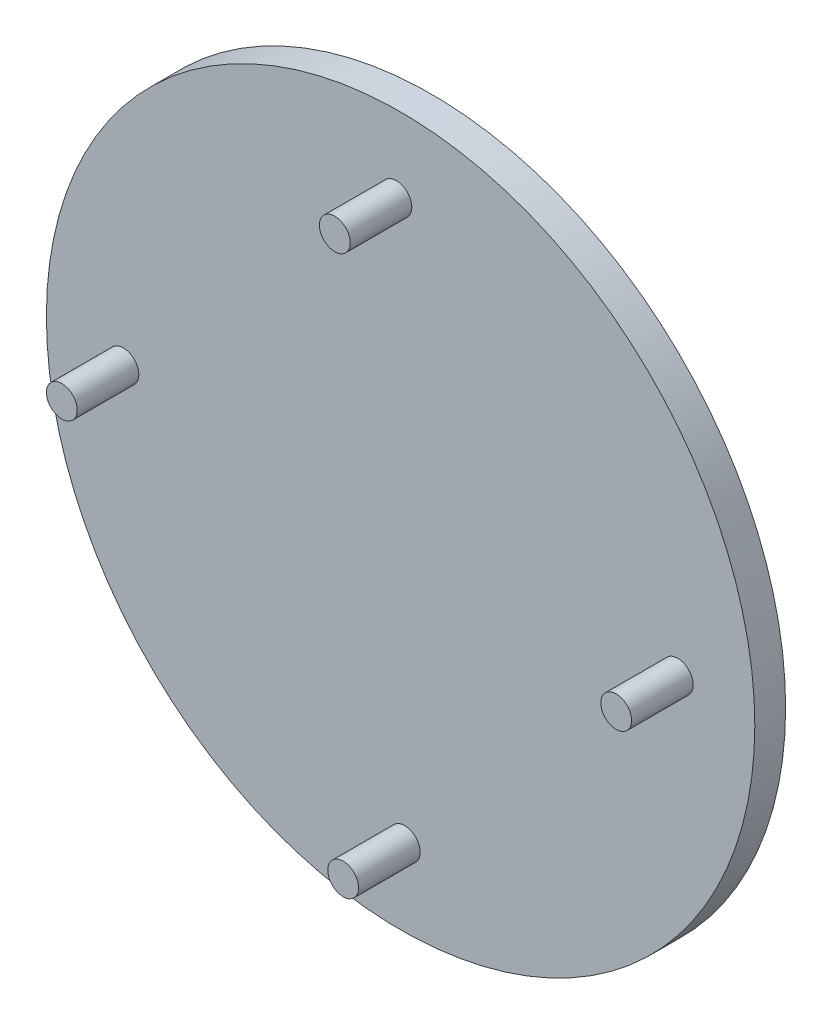
ISO-10303-21;
HEADER;
FILE_DESCRIPTION(('STEP AP214'),'2;1');
FILE_NAME('part.step','',(''),(''),'','','');
FILE_SCHEMA(('AUTOMOTIVE_DESIGN { 1 0 10303 214 1 1 1 1 }'));
ENDSEC;
DATA;
#1=APPLICATION_CONTEXT('core data for automotive mechanical design processes');
#2=APPLICATION_PROTOCOL_DEFINITION('international standard','automotive_design',2000,#1);
#3=PRODUCT_CONTEXT('',#1,'mechanical');
#4=PRODUCT('Part','Part','',(#3));
#5=PRODUCT_RELATED_PRODUCT_CATEGORY('part','',(#4));
#6=PRODUCT_DEFINITION_FORMATION('','',#4);
#7=PRODUCT_DEFINITION_CONTEXT('part definition',#1,'design');
#8=PRODUCT_DEFINITION('design','',#6,#7);
#9=PRODUCT_DEFINITION_SHAPE('','',#8);
#10=(LENGTH_UNIT() NAMED_UNIT(*) SI_UNIT(.MILLI.,.METRE.));
#11=(NAMED_UNIT(*) PLANE_ANGLE_UNIT() SI_UNIT($,.RADIAN.));
#12=(NAMED_UNIT(*) SI_UNIT($,.STERADIAN.) SOLID_ANGLE_UNIT());
#13=UNCERTAINTY_MEASURE_WITH_UNIT(LENGTH_MEASURE(1.E-05),#10,'distance_accuracy_value','');
#14=(GEOMETRIC_REPRESENTATION_CONTEXT(3) GLOBAL_UNCERTAINTY_ASSIGNED_CONTEXT((#13)) GLOBAL_UNIT_ASSIGNED_CONTEXT((#10,
#11,#12)) REPRESENTATION_CONTEXT('',''));
#15=CARTESIAN_POINT('',(0.,0.,0.));
#16=DIRECTION('',(0.,0.,1.));
#17=DIRECTION('',(1.,0.,0.));
#18=AXIS2_PLACEMENT_3D('',#15,#16,#17);
#19=CARTESIAN_POINT('',(0.,-0.253320710516766,-1.));
#20=DIRECTION('',(0.,0.,1.));
#21=DIRECTION('',(1.,0.,0.));
#22=AXIS2_PLACEMENT_3D('',#19,#20,#21);
#23=CYLINDRICAL_SURFACE('',#22,11.5);
#24=CARTESIAN_POINT('',(0.,-0.253320710516766,-1.));
#25=DIRECTION('',(0.,0.,1.));
#26=DIRECTION('',(1.,0.,0.));
#27=AXIS2_PLACEMENT_3D('',#24,#25,#26);
#28=CIRCLE('',#27,11.5);
#29=CARTESIAN_POINT('',(11.5,-0.253320710516766,-1.));
#30=VERTEX_POINT('',#29);
#31=EDGE_CURVE('E10',#30,#30,#28,.T.);
#32=ORIENTED_EDGE('',*,*,#31,.T.);
#33=EDGE_LOOP('',(#32));
#34=FACE_BOUND('',#33,.T.);
#35=CARTESIAN_POINT('',(0.,-0.253320710516766,0.));
#36=DIRECTION('',(0.,0.,1.));
#37=DIRECTION('',(1.,0.,0.));
#38=AXIS2_PLACEMENT_3D('',#35,#36,#37);
#39=CIRCLE('',#38,11.5);
#40=CARTESIAN_POINT('',(11.5,-0.253320710516766,0.));
#41=VERTEX_POINT('',#40);
#42=EDGE_CURVE('E34',#41,#41,#39,.T.);
#43=ORIENTED_EDGE('',*,*,#42,.F.);
#44=EDGE_LOOP('',(#43));
#45=FACE_BOUND('',#44,.T.);
#46=ADVANCED_FACE('F31',(#34,#45),#23,.T.);
#47=CARTESIAN_POINT('',(0.,-0.253320710516766,-1.));
#48=DIRECTION('',(0.,0.,1.));
#49=DIRECTION('',(1.,0.,0.));
#50=AXIS2_PLACEMENT_3D('',#47,#48,#49);
#51=PLANE('',#50);
#52=ORIENTED_EDGE('',*,*,#31,.F.);
#53=EDGE_LOOP('',(#52));
#54=FACE_BOUND('',#53,.T.);
#55=ADVANCED_FACE('F80',(#54),#51,.F.);
#56=CARTESIAN_POINT('',(0.,-0.253320710516766,0.));
#57=DIRECTION('',(0.,0.,1.));
#58=DIRECTION('',(1.,0.,0.));
#59=AXIS2_PLACEMENT_3D('',#56,#57,#58);
#60=PLANE('',#59);
#61=CARTESIAN_POINT('',(0.13604294308137,-9.25255656281363,0.));
#62=DIRECTION('',(0.,0.,1.));
#63=DIRECTION('',(0.,-1.,0.));
#64=AXIS2_PLACEMENT_3D('',#61,#62,#63);
#65=CIRCLE('',#64,0.500000000000001);
#66=CARTESIAN_POINT('',(0.136042943081375,-9.75255656281363,0.));
#67=VERTEX_POINT('',#66);
#68=EDGE_CURVE('E61',#67,#67,#65,.T.);
#69=ORIENTED_EDGE('',*,*,#68,.F.);
#70=EDGE_LOOP('',(#69));
#71=FACE_BOUND('',#70,.T.);
#72=CARTESIAN_POINT('',(-8.99923585229687,-0.389363653598041,0.));
#73=DIRECTION('',(0.,0.,1.));
#74=DIRECTION('',(-1.,0.,0.));
#75=AXIS2_PLACEMENT_3D('',#72,#73,#74);
#76=CIRCLE('',#75,0.500000000000001);
#77=CARTESIAN_POINT('',(-9.49923585229687,-0.389363653598041,0.));
#78=VERTEX_POINT('',#77);
#79=EDGE_CURVE('E55',#78,#78,#76,.T.);
#80=ORIENTED_EDGE('',*,*,#79,.F.);
#81=EDGE_LOOP('',(#80));
#82=FACE_BOUND('',#81,.T.);
#83=CARTESIAN_POINT('',(-0.136042943081307,8.7459151417801,0.));
#84=DIRECTION('',(0.,0.,1.));
#85=DIRECTION('',(0.,1.,0.));
#86=AXIS2_PLACEMENT_3D('',#83,#84,#85);
#87=CIRCLE('',#86,0.500000000000001);
#88=CARTESIAN_POINT('',(-0.136042943081309,9.2459151417801,0.));
#89=VERTEX_POINT('',#88);
#90=EDGE_CURVE('E49',#89,#89,#87,.T.);
#91=ORIENTED_EDGE('',*,*,#90,.F.);
#92=EDGE_LOOP('',(#91));
#93=FACE_BOUND('',#92,.T.);
#94=CARTESIAN_POINT('',(8.99923585229687,-0.11727776743549,0.));
#95=DIRECTION('',(0.,0.,1.));
#96=DIRECTION('',(1.,0.,0.));
#97=AXIS2_PLACEMENT_3D('',#94,#95,#96);
#98=CIRCLE('',#97,0.500000000000001);
#99=CARTESIAN_POINT('',(9.49923585229687,-0.11727776743549,0.));
#100=VERTEX_POINT('',#99);
#101=EDGE_CURVE('E43',#100,#100,#98,.T.);
#102=ORIENTED_EDGE('',*,*,#101,.F.);
#103=EDGE_LOOP('',(#102));
#104=FACE_BOUND('',#103,.T.);
#105=ORIENTED_EDGE('',*,*,#42,.T.);
#106=EDGE_LOOP('',(#105));
#107=FACE_BOUND('',#106,.T.);
#108=ADVANCED_FACE('F76',(#71,#82,#93,#104,#107),#60,.T.);
#109=CARTESIAN_POINT('',(8.99923585229687,-0.11727776743549,2.));
#110=DIRECTION('',(0.,0.,-1.));
#111=DIRECTION('',(-1.,0.,0.));
#112=AXIS2_PLACEMENT_3D('',#109,#110,#111);
#113=CYLINDRICAL_SURFACE('',#112,0.500000000000001);
#114=CARTESIAN_POINT('',(8.99923585229687,-0.11727776743549,2.));
#115=DIRECTION('',(0.,0.,1.));
#116=DIRECTION('',(1.,0.,0.));
#117=AXIS2_PLACEMENT_3D('',#114,#115,#116);
#118=CIRCLE('',#117,0.500000000000001);
#119=CARTESIAN_POINT('',(9.49923585229687,-0.11727776743549,2.));
#120=VERTEX_POINT('',#119);
#121=EDGE_CURVE('E41',#120,#120,#118,.T.);
#122=ORIENTED_EDGE('',*,*,#121,.F.);
#123=EDGE_LOOP('',(#122));
#124=FACE_BOUND('',#123,.T.);
#125=ORIENTED_EDGE('',*,*,#101,.T.);
#126=EDGE_LOOP('',(#125));
#127=FACE_BOUND('',#126,.T.);
#128=ADVANCED_FACE('F79',(#124,#127),#113,.T.);
#129=CARTESIAN_POINT('',(8.99923585229687,-0.11727776743549,2.));
#130=DIRECTION('',(0.,0.,1.));
#131=DIRECTION('',(1.,0.,0.));
#132=AXIS2_PLACEMENT_3D('',#129,#130,#131);
#133=PLANE('',#132);
#134=ORIENTED_EDGE('',*,*,#121,.T.);
#135=EDGE_LOOP('',(#134));
#136=FACE_BOUND('',#135,.T.);
#137=ADVANCED_FACE('F100',(#136),#133,.T.);
#138=CARTESIAN_POINT('',(-0.136042943081307,8.7459151417801,2.));
#139=DIRECTION('',(0.,0.,-1.));
#140=DIRECTION('',(-1.,0.,0.));
#141=AXIS2_PLACEMENT_3D('',#138,#139,#140);
#142=CYLINDRICAL_SURFACE('',#141,0.500000000000001);
#143=CARTESIAN_POINT('',(-0.136042943081307,8.7459151417801,2.));
#144=DIRECTION('',(0.,0.,1.));
#145=DIRECTION('',(0.,1.,0.));
#146=AXIS2_PLACEMENT_3D('',#143,#144,#145);
#147=CIRCLE('',#146,0.500000000000001);
#148=CARTESIAN_POINT('',(-0.136042943081309,9.2459151417801,2.));
#149=VERTEX_POINT('',#148);
#150=EDGE_CURVE('E46',#149,#149,#147,.T.);
#151=ORIENTED_EDGE('',*,*,#150,.F.);
#152=EDGE_LOOP('',(#151));
#153=FACE_BOUND('',#152,.T.);
#154=ORIENTED_EDGE('',*,*,#90,.T.);
#155=EDGE_LOOP('',(#154));
#156=FACE_BOUND('',#155,.T.);
#157=ADVANCED_FACE('F104',(#153,#156),#142,.T.);
#158=CARTESIAN_POINT('',(-0.136042943081307,8.7459151417801,2.));
#159=DIRECTION('',(0.,0.,1.));
#160=DIRECTION('',(0.,1.,0.));
#161=AXIS2_PLACEMENT_3D('',#158,#159,#160);
#162=PLANE('',#161);
#163=ORIENTED_EDGE('',*,*,#150,.T.);
#164=EDGE_LOOP('',(#163));
#165=FACE_BOUND('',#164,.T.);
#166=ADVANCED_FACE('F108',(#165),#162,.T.);
#167=CARTESIAN_POINT('',(-8.99923585229687,-0.389363653598041,2.));
#168=DIRECTION('',(0.,0.,-1.));
#169=DIRECTION('',(-1.,0.,0.));
#170=AXIS2_PLACEMENT_3D('',#167,#168,#169);
#171=CYLINDRICAL_SURFACE('',#170,0.500000000000001);
#172=CARTESIAN_POINT('',(-8.99923585229687,-0.389363653598041,2.));
#173=DIRECTION('',(0.,0.,1.));
#174=DIRECTION('',(-1.,0.,0.));
#175=AXIS2_PLACEMENT_3D('',#172,#173,#174);
#176=CIRCLE('',#175,0.500000000000001);
#177=CARTESIAN_POINT('',(-9.49923585229687,-0.389363653598041,2.));
#178=VERTEX_POINT('',#177);
#179=EDGE_CURVE('E52',#178,#178,#176,.T.);
#180=ORIENTED_EDGE('',*,*,#179,.F.);
#181=EDGE_LOOP('',(#180));
#182=FACE_BOUND('',#181,.T.);
#183=ORIENTED_EDGE('',*,*,#79,.T.);
#184=EDGE_LOOP('',(#183));
#185=FACE_BOUND('',#184,.T.);
#186=ADVANCED_FACE('F112',(#182,#185),#171,.T.);
#187=CARTESIAN_POINT('',(-8.99923585229687,-0.389363653598041,2.));
#188=DIRECTION('',(0.,0.,1.));
#189=DIRECTION('',(-1.,0.,0.));
#190=AXIS2_PLACEMENT_3D('',#187,#188,#189);
#191=PLANE('',#190);
#192=ORIENTED_EDGE('',*,*,#179,.T.);
#193=EDGE_LOOP('',(#192));
#194=FACE_BOUND('',#193,.T.);
#195=ADVANCED_FACE('F72',(#194),#191,.T.);
#196=CARTESIAN_POINT('',(0.13604294308137,-9.25255656281363,2.));
#197=DIRECTION('',(0.,0.,-1.));
#198=DIRECTION('',(-1.,0.,0.));
#199=AXIS2_PLACEMENT_3D('',#196,#197,#198);
#200=CYLINDRICAL_SURFACE('',#199,0.500000000000001);
#201=CARTESIAN_POINT('',(0.13604294308137,-9.25255656281363,2.));
#202=DIRECTION('',(0.,0.,1.));
#203=DIRECTION('',(0.,-1.,0.));
#204=AXIS2_PLACEMENT_3D('',#201,#202,#203);
#205=CIRCLE('',#204,0.500000000000001);
#206=CARTESIAN_POINT('',(0.136042943081375,-9.75255656281363,2.));
#207=VERTEX_POINT('',#206);
#208=EDGE_CURVE('E58',#207,#207,#205,.T.);
#209=ORIENTED_EDGE('',*,*,#208,.F.);
#210=EDGE_LOOP('',(#209));
#211=FACE_BOUND('',#210,.T.);
#212=ORIENTED_EDGE('',*,*,#68,.T.);
#213=EDGE_LOOP('',(#212));
#214=FACE_BOUND('',#213,.T.);
#215=ADVANCED_FACE('F69',(#211,#214),#200,.T.);
#216=CARTESIAN_POINT('',(0.13604294308137,-9.25255656281363,2.));
#217=DIRECTION('',(0.,0.,1.));
#218=DIRECTION('',(0.,-1.,0.));
#219=AXIS2_PLACEMENT_3D('',#216,#217,#218);
#220=PLANE('',#219);
#221=ORIENTED_EDGE('',*,*,#208,.T.);
#222=EDGE_LOOP('',(#221));
#223=FACE_BOUND('',#222,.T.);
#224=ADVANCED_FACE('F67',(#223),#220,.T.);
#225=CLOSED_SHELL('',(#46,#55,#108,#128,#137,#157,#166,#186,#195,#215,#224));
#226=MANIFOLD_SOLID_BREP('B2',#225);
#227=ADVANCED_BREP_SHAPE_REPRESENTATION('',(#18,#226),#14);
#228=SHAPE_DEFINITION_REPRESENTATION(#9,#227);
ENDSEC;
END-ISO-10303-21;
